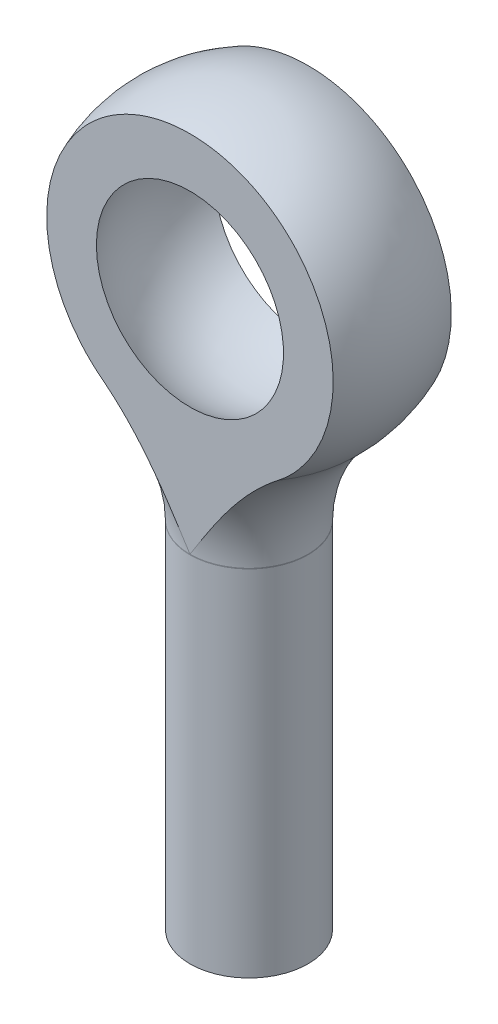
ISO-10303-21;
HEADER;
FILE_DESCRIPTION(('STEP AP214'),'2;1');
FILE_NAME('part.step','',(''),(''),'','','');
FILE_SCHEMA(('AUTOMOTIVE_DESIGN { 1 0 10303 214 1 1 1 1 }'));
ENDSEC;
DATA;
#1=APPLICATION_CONTEXT('core data for automotive mechanical design processes');
#2=APPLICATION_PROTOCOL_DEFINITION('international standard','automotive_design',2000,#1);
#3=PRODUCT_CONTEXT('',#1,'mechanical');
#4=PRODUCT('Part','Part','',(#3));
#5=PRODUCT_RELATED_PRODUCT_CATEGORY('part','',(#4));
#6=PRODUCT_DEFINITION_FORMATION('','',#4);
#7=PRODUCT_DEFINITION_CONTEXT('part definition',#1,'design');
#8=PRODUCT_DEFINITION('design','',#6,#7);
#9=PRODUCT_DEFINITION_SHAPE('','',#8);
#10=(LENGTH_UNIT() NAMED_UNIT(*) SI_UNIT(.MILLI.,.METRE.));
#11=(NAMED_UNIT(*) PLANE_ANGLE_UNIT() SI_UNIT($,.RADIAN.));
#12=(NAMED_UNIT(*) SI_UNIT($,.STERADIAN.) SOLID_ANGLE_UNIT());
#13=UNCERTAINTY_MEASURE_WITH_UNIT(LENGTH_MEASURE(1.E-05),#10,'distance_accuracy_value','');
#14=(GEOMETRIC_REPRESENTATION_CONTEXT(3) GLOBAL_UNCERTAINTY_ASSIGNED_CONTEXT((#13)) GLOBAL_UNIT_ASSIGNED_CONTEXT((#10,
#11,#12)) REPRESENTATION_CONTEXT('',''));
#15=CARTESIAN_POINT('',(0.,0.,0.));
#16=DIRECTION('',(0.,0.,1.));
#17=DIRECTION('',(1.,0.,0.));
#18=AXIS2_PLACEMENT_3D('',#15,#16,#17);
#19=CARTESIAN_POINT('',(0.,500000.,0.));
#20=DIRECTION('',(0.,-1.,0.));
#21=DIRECTION('',(0.,0.,-1.));
#22=AXIS2_PLACEMENT_3D('',#19,#20,#21);
#23=CYLINDRICAL_SURFACE('',#22,6.35);
#24=CARTESIAN_POINT('',(0.,-61.9252,0.));
#25=DIRECTION('',(0.,1.,0.));
#26=DIRECTION('',(0.,0.,1.));
#27=AXIS2_PLACEMENT_3D('',#24,#25,#26);
#28=CIRCLE('',#27,6.35);
#29=CARTESIAN_POINT('',(0.,-61.9252,6.35));
#30=VERTEX_POINT('',#29);
#31=EDGE_CURVE('E207',#30,#30,#28,.T.);
#32=ORIENTED_EDGE('',*,*,#31,.T.);
#33=EDGE_LOOP('',(#32));
#34=FACE_BOUND('',#33,.T.);
#35=CARTESIAN_POINT('',(0.,-23.8251999999761,0.));
#36=DIRECTION('',(0.,1.,0.));
#37=DIRECTION('',(0.,0.,1.));
#38=AXIS2_PLACEMENT_3D('',#35,#36,#37);
#39=CIRCLE('',#38,6.35);
#40=CARTESIAN_POINT('',(0.,-23.8251999999761,6.35));
#41=VERTEX_POINT('',#40);
#42=EDGE_CURVE('E11',#41,#41,#39,.T.);
#43=ORIENTED_EDGE('',*,*,#42,.F.);
#44=EDGE_LOOP('',(#43));
#45=FACE_BOUND('',#44,.T.);
#46=ADVANCED_FACE('F33',(#34,#45),#23,.T.);
#47=CARTESIAN_POINT('',(0.,-23.764085796849,0.));
#48=DIRECTION('',(0.,1.,0.));
#49=DIRECTION('',(0.,0.,1.));
#50=AXIS2_PLACEMENT_3D('',#47,#48,#49);
#51=TOROIDAL_SURFACE('',#50,22.225,15.875);
#52=CARTESIAN_POINT('',(0.,-23.7640857968699,0.));
#53=DIRECTION('',(0.,1.,0.));
#54=DIRECTION('',(0.,0.,1.));
#55=AXIS2_PLACEMENT_3D('',#52,#53,#54);
#56=CIRCLE('',#55,6.35);
#57=CARTESIAN_POINT('',(0.,-23.7640857968699,6.35));
#58=VERTEX_POINT('',#57);
#59=CARTESIAN_POINT('',(0.,-23.7640857968699,-6.35));
#60=VERTEX_POINT('',#59);
#61=EDGE_CURVE('E57',#58,#60,#56,.F.);
#62=ORIENTED_EDGE('',*,*,#61,.F.);
#63=CARTESIAN_POINT('',(0.,-23.764085796849,6.35));
#64=CARTESIAN_POINT('',(-0.00448984716126769,-23.7569867241387,6.35));
#65=CARTESIAN_POINT('',(-0.00897969462927698,-23.7498876519898,6.35));
#66=CARTESIAN_POINT('',(-0.583050319482661,-22.842204567849,6.35));
#67=CARTESIAN_POINT('',(-1.15275727114214,-21.9417066279042,6.35));
#68=CARTESIAN_POINT('',(-2.32335162742201,-20.160177709213,6.35));
#69=CARTESIAN_POINT('',(-2.92424781876735,-19.2791523170995,6.35));
#70=CARTESIAN_POINT('',(-3.86795157505741,-17.9901471026716,6.35));
#71=CARTESIAN_POINT('',(-4.18913741672609,-17.5664271345477,6.35));
#72=CARTESIAN_POINT('',(-4.84845598241763,-16.7324294342148,6.35));
#73=CARTESIAN_POINT('',(-5.18658595834078,-16.3221495399508,6.35));
#74=CARTESIAN_POINT('',(-5.88177845584032,-15.5184579602398,6.35));
#75=CARTESIAN_POINT('',(-6.23882540206243,-15.1250328656359,6.35));
#76=CARTESIAN_POINT('',(-6.97363010371919,-14.3581134853306,6.35));
#77=CARTESIAN_POINT('',(-7.35138337572862,-13.98461491934,6.35));
#78=CARTESIAN_POINT('',(-8.16180930720019,-13.230048098124,6.35));
#79=CARTESIAN_POINT('',(-8.59641862075767,-12.8510482302285,6.35));
#80=CARTESIAN_POINT('',(-9.4916436740845,-12.1249915308166,6.35));
#81=CARTESIAN_POINT('',(-9.95225948168154,-11.7779347826175,6.35));
#82=CARTESIAN_POINT('',(-10.8993622631317,-11.1199434841251,6.35));
#83=CARTESIAN_POINT('',(-11.3858737819888,-10.8090441271136,6.35));
#84=CARTESIAN_POINT('',(-12.3828049973355,-10.2281483905436,6.35));
#85=CARTESIAN_POINT('',(-12.893224404853,-9.9581515167679,6.35));
#86=CARTESIAN_POINT('',(-13.9397980953899,-9.46116102092254,6.35));
#87=CARTESIAN_POINT('',(-14.4761289787481,-9.23453789324361,6.35));
#88=CARTESIAN_POINT('',(-15.5672362557874,-8.83091626349336,6.35));
#89=CARTESIAN_POINT('',(-16.1220132687936,-8.65391942950051,6.35));
#90=CARTESIAN_POINT('',(-17.2451790893523,-8.35308665898777,6.35));
#91=CARTESIAN_POINT('',(-17.8135518452561,-8.22919101180703,6.35));
#92=CARTESIAN_POINT('',(-18.9596366725442,-8.03703020888307,6.35));
#93=CARTESIAN_POINT('',(-19.5373477965836,-7.96875944586452,6.35));
#94=CARTESIAN_POINT('',(-20.6392597037418,-7.89379535041776,6.35));
#95=CARTESIAN_POINT('',(-21.1630945300894,-7.88167392137649,6.35));
#96=CARTESIAN_POINT('',(-22.2096193822471,-7.90521199826917,6.35));
#97=CARTESIAN_POINT('',(-22.7323095864623,-7.94086343474808,6.35));
#98=CARTESIAN_POINT('',(-23.7748382287456,-8.06073443349305,6.35));
#99=CARTESIAN_POINT('',(-24.294649486187,-8.14519507601028,6.35));
#100=CARTESIAN_POINT('',(-25.0666389602046,-8.30835636806882,6.35));
#101=CARTESIAN_POINT('',(-25.322781678413,-8.36885332253963,6.35));
#102=CARTESIAN_POINT('',(-25.8319149361716,-8.50194972045422,6.35));
#103=CARTESIAN_POINT('',(-26.0849053338249,-8.57454970659687,6.35));
#104=CARTESIAN_POINT('',(-26.336056281303,-8.65316887921814,6.35));
#105=B_SPLINE_CURVE_WITH_KNOTS('',3,(#63,#64,#65,#66,#67,#68,#69,#70,#71,#72,#73,#74,#75,#76,
#77,#78,#79,#80,#81,#82,#83,#84,#85,#86,#87,#88,#89,#90,#91,#92,#93,#94,#95,#96,#97,#98,#99,
#100,#101,#102,#103,#104),.UNSPECIFIED.,.F.,.F.,(4,2,2,2,2,2,2,2,2,2,2,2,2,2,2,2,2,2,2,2,4),(0.,
0.0251992063367074,3.2219577543257,6.41962184317637,8.01434035113322,9.60880105008244,
11.2019687507058,12.7947928438808,14.5233847271884,16.2519811190548,17.9822461783528,
19.7124903295038,21.4569120178464,23.2013923340514,24.9439058559148,26.6862437016848,
28.2560519342562,29.8255950393301,31.4029575667671,32.1922698221303,32.9816174797104),.UNSPECIFIED.);
#106=CARTESIAN_POINT('',(-9.44532893185531,-12.1695864814322,6.35));
#107=VERTEX_POINT('',#106);
#108=EDGE_CURVE('E50',#58,#107,#105,.T.);
#109=ORIENTED_EDGE('',*,*,#108,.T.);
#110=CARTESIAN_POINT('',(0.,-12.1695864814465,0.));
#111=DIRECTION('',(0.,1.,0.));
#112=DIRECTION('',(0.,0.,1.));
#113=AXIS2_PLACEMENT_3D('',#110,#111,#112);
#114=CIRCLE('',#113,11.3814207650273);
#115=CARTESIAN_POINT('',(-9.44532893185531,-12.1695864814322,-6.35));
#116=VERTEX_POINT('',#115);
#117=EDGE_CURVE('E43',#116,#107,#114,.T.);
#118=ORIENTED_EDGE('',*,*,#117,.F.);
#119=CARTESIAN_POINT('',(0.,-23.764085796849,-6.35));
#120=CARTESIAN_POINT('',(-0.00448984716126769,-23.7569867241387,-6.35));
#121=CARTESIAN_POINT('',(-0.00897969462927698,-23.7498876519898,-6.35));
#122=CARTESIAN_POINT('',(-0.583050319482661,-22.842204567849,-6.35));
#123=CARTESIAN_POINT('',(-1.15275727114214,-21.9417066279042,-6.35));
#124=CARTESIAN_POINT('',(-2.32335162742201,-20.160177709213,-6.35));
#125=CARTESIAN_POINT('',(-2.92424781876735,-19.2791523170995,-6.35));
#126=CARTESIAN_POINT('',(-3.86795157505741,-17.9901471026716,-6.35));
#127=CARTESIAN_POINT('',(-4.18913741672609,-17.5664271345477,-6.35));
#128=CARTESIAN_POINT('',(-4.84845598241763,-16.7324294342148,-6.35));
#129=CARTESIAN_POINT('',(-5.18658595834078,-16.3221495399508,-6.35));
#130=CARTESIAN_POINT('',(-5.88177845584032,-15.5184579602398,-6.35));
#131=CARTESIAN_POINT('',(-6.23882540206243,-15.1250328656359,-6.35));
#132=CARTESIAN_POINT('',(-6.97363010371919,-14.3581134853306,-6.35));
#133=CARTESIAN_POINT('',(-7.35138337572862,-13.98461491934,-6.35));
#134=CARTESIAN_POINT('',(-8.16180930720019,-13.230048098124,-6.35));
#135=CARTESIAN_POINT('',(-8.59641862075767,-12.8510482302285,-6.35));
#136=CARTESIAN_POINT('',(-9.4916436740845,-12.1249915308166,-6.35));
#137=CARTESIAN_POINT('',(-9.95225948168154,-11.7779347826175,-6.35));
#138=CARTESIAN_POINT('',(-10.8993622631317,-11.1199434841251,-6.35));
#139=CARTESIAN_POINT('',(-11.3858737819888,-10.8090441271136,-6.35));
#140=CARTESIAN_POINT('',(-12.3828049973355,-10.2281483905436,-6.35));
#141=CARTESIAN_POINT('',(-12.893224404853,-9.9581515167679,-6.35));
#142=CARTESIAN_POINT('',(-13.9397980953899,-9.46116102092254,-6.35));
#143=CARTESIAN_POINT('',(-14.4761289787481,-9.23453789324361,-6.35));
#144=CARTESIAN_POINT('',(-15.5672362557874,-8.83091626349336,-6.35));
#145=CARTESIAN_POINT('',(-16.1220132687936,-8.65391942950051,-6.35));
#146=CARTESIAN_POINT('',(-17.2451790893523,-8.35308665898777,-6.35));
#147=CARTESIAN_POINT('',(-17.8135518452561,-8.22919101180703,-6.35));
#148=CARTESIAN_POINT('',(-18.9596366725442,-8.03703020888307,-6.35));
#149=CARTESIAN_POINT('',(-19.5373477965836,-7.96875944586452,-6.35));
#150=CARTESIAN_POINT('',(-20.6392597037418,-7.89379535041776,-6.35));
#151=CARTESIAN_POINT('',(-21.1630945300894,-7.88167392137649,-6.35));
#152=CARTESIAN_POINT('',(-22.2096193822471,-7.90521199826917,-6.35));
#153=CARTESIAN_POINT('',(-22.7323095864623,-7.94086343474808,-6.35));
#154=CARTESIAN_POINT('',(-23.7748382287456,-8.06073443349305,-6.35));
#155=CARTESIAN_POINT('',(-24.294649486187,-8.14519507601028,-6.35));
#156=CARTESIAN_POINT('',(-25.0666389602046,-8.30835636806882,-6.35));
#157=CARTESIAN_POINT('',(-25.322781678413,-8.36885332253963,-6.35));
#158=CARTESIAN_POINT('',(-25.8319149361716,-8.50194972045422,-6.35));
#159=CARTESIAN_POINT('',(-26.0849053338249,-8.57454970659687,-6.35));
#160=CARTESIAN_POINT('',(-26.336056281303,-8.65316887921814,-6.35));
#161=B_SPLINE_CURVE_WITH_KNOTS('',3,(#119,#120,#121,#122,#123,#124,#125,#126,#127,#128,#129,
#130,#131,#132,#133,#134,#135,#136,#137,#138,#139,#140,#141,#142,#143,#144,#145,#146,#147,#148,
#149,#150,#151,#152,#153,#154,#155,#156,#157,#158,#159,#160),.UNSPECIFIED.,.F.,.F.,(4,2,2,2,2,2,
2,2,2,2,2,2,2,2,2,2,2,2,2,2,4),(0.,0.0251992063367074,3.2219577543257,6.41962184317637,
8.01434035113322,9.60880105008244,11.2019687507058,12.7947928438808,14.5233847271884,
16.2519811190548,17.9822461783528,19.7124903295038,21.4569120178464,23.2013923340514,
24.9439058559148,26.6862437016848,28.2560519342562,29.8255950393301,31.4029575667671,
32.1922698221303,32.9816174797104),.UNSPECIFIED.);
#162=EDGE_CURVE('E94',#116,#60,#161,.F.);
#163=ORIENTED_EDGE('',*,*,#162,.T.);
#164=EDGE_LOOP('',(#62,#109,#118,#163));
#165=FACE_BOUND('',#164,.T.);
#166=ADVANCED_FACE('F110',(#165),#51,.F.);
#167=CARTESIAN_POINT('',(0.,0.,0.));
#168=DIRECTION('',(0.,-1.,0.));
#169=DIRECTION('',(1.,0.,0.));
#170=AXIS2_PLACEMENT_3D('',#167,#168,#169);
#171=SPHERICAL_SURFACE('',#170,16.6624);
#172=ORIENTED_EDGE('',*,*,#117,.T.);
#173=CARTESIAN_POINT('',(0.,0.,6.35));
#174=DIRECTION('',(0.,0.,-1.));
#175=DIRECTION('',(-1.,0.,0.));
#176=AXIS2_PLACEMENT_3D('',#173,#174,#175);
#177=CIRCLE('',#176,15.4049691255776);
#178=CARTESIAN_POINT('',(9.44532893185531,-12.1695864814322,6.35));
#179=VERTEX_POINT('',#178);
#180=EDGE_CURVE('E71',#107,#179,#177,.T.);
#181=ORIENTED_EDGE('',*,*,#180,.T.);
#182=CARTESIAN_POINT('',(9.44532893185531,-12.1695864814322,-6.35));
#183=VERTEX_POINT('',#182);
#184=EDGE_CURVE('E81',#179,#183,#114,.T.);
#185=ORIENTED_EDGE('',*,*,#184,.T.);
#186=CARTESIAN_POINT('',(0.,0.,-6.35));
#187=DIRECTION('',(0.,0.,1.));
#188=DIRECTION('',(1.,0.,0.));
#189=AXIS2_PLACEMENT_3D('',#186,#187,#188);
#190=CIRCLE('',#189,15.4049691255776);
#191=EDGE_CURVE('E206',#183,#116,#190,.T.);
#192=ORIENTED_EDGE('',*,*,#191,.T.);
#193=EDGE_LOOP('',(#172,#181,#185,#192));
#194=FACE_BOUND('',#193,.T.);
#195=ADVANCED_FACE('F79',(#194),#171,.T.);
#196=CARTESIAN_POINT('',(0.,-61.9252,0.));
#197=DIRECTION('',(0.,1.,0.));
#198=DIRECTION('',(0.,0.,1.));
#199=AXIS2_PLACEMENT_3D('',#196,#197,#198);
#200=PLANE('',#199);
#201=ORIENTED_EDGE('',*,*,#31,.F.);
#202=EDGE_LOOP('',(#201));
#203=FACE_BOUND('',#202,.T.);
#204=ADVANCED_FACE('F123',(#203),#200,.F.);
#205=ORIENTED_EDGE('',*,*,#42,.T.);
#206=EDGE_LOOP('',(#205));
#207=FACE_BOUND('',#206,.T.);
#208=EDGE_CURVE('E88',#60,#58,#56,.F.);
#209=ORIENTED_EDGE('',*,*,#208,.T.);
#210=ORIENTED_EDGE('',*,*,#61,.T.);
#211=EDGE_LOOP('',(#209,#210));
#212=FACE_BOUND('',#211,.T.);
#213=ADVANCED_FACE('F113',(#207,#212),#23,.T.);
#214=ORIENTED_EDGE('',*,*,#184,.F.);
#215=CARTESIAN_POINT('',(0.,-23.764085796849,6.35));
#216=CARTESIAN_POINT('',(0.00448984716126769,-23.7569867241387,6.35));
#217=CARTESIAN_POINT('',(0.00897969462927698,-23.7498876519898,6.35));
#218=CARTESIAN_POINT('',(0.583050319482661,-22.842204567849,6.35));
#219=CARTESIAN_POINT('',(1.15275727114214,-21.9417066279042,6.35));
#220=CARTESIAN_POINT('',(2.32335162742201,-20.160177709213,6.35));
#221=CARTESIAN_POINT('',(2.92424781876735,-19.2791523170995,6.35));
#222=CARTESIAN_POINT('',(3.86795157505741,-17.9901471026716,6.35));
#223=CARTESIAN_POINT('',(4.18913741672609,-17.5664271345477,6.35));
#224=CARTESIAN_POINT('',(4.84845598241763,-16.7324294342148,6.35));
#225=CARTESIAN_POINT('',(5.18658595834078,-16.3221495399508,6.35));
#226=CARTESIAN_POINT('',(5.88177845584032,-15.5184579602398,6.35));
#227=CARTESIAN_POINT('',(6.23882540206243,-15.1250328656359,6.35));
#228=CARTESIAN_POINT('',(6.97363010371919,-14.3581134853306,6.35));
#229=CARTESIAN_POINT('',(7.35138337572862,-13.98461491934,6.35));
#230=CARTESIAN_POINT('',(8.16180930720019,-13.230048098124,6.35));
#231=CARTESIAN_POINT('',(8.59641862075767,-12.8510482302285,6.35));
#232=CARTESIAN_POINT('',(9.4916436740845,-12.1249915308166,6.35));
#233=CARTESIAN_POINT('',(9.95225948168154,-11.7779347826175,6.35));
#234=CARTESIAN_POINT('',(10.8993622631317,-11.1199434841251,6.35));
#235=CARTESIAN_POINT('',(11.3858737819888,-10.8090441271136,6.35));
#236=CARTESIAN_POINT('',(12.3828049973355,-10.2281483905436,6.35));
#237=CARTESIAN_POINT('',(12.893224404853,-9.9581515167679,6.35));
#238=CARTESIAN_POINT('',(13.9397980953899,-9.46116102092254,6.35));
#239=CARTESIAN_POINT('',(14.4761289787481,-9.23453789324361,6.35));
#240=CARTESIAN_POINT('',(15.5672362557874,-8.83091626349336,6.35));
#241=CARTESIAN_POINT('',(16.1220132687936,-8.65391942950051,6.35));
#242=CARTESIAN_POINT('',(17.2451790893523,-8.35308665898777,6.35));
#243=CARTESIAN_POINT('',(17.8135518452561,-8.22919101180703,6.35));
#244=CARTESIAN_POINT('',(18.9596366725442,-8.03703020888307,6.35));
#245=CARTESIAN_POINT('',(19.5373477965836,-7.96875944586452,6.35));
#246=CARTESIAN_POINT('',(20.6392597037418,-7.89379535041776,6.35));
#247=CARTESIAN_POINT('',(21.1630945300894,-7.88167392137649,6.35));
#248=CARTESIAN_POINT('',(22.2096193822471,-7.90521199826917,6.35));
#249=CARTESIAN_POINT('',(22.7323095864623,-7.94086343474808,6.35));
#250=CARTESIAN_POINT('',(23.7748382287456,-8.06073443349305,6.35));
#251=CARTESIAN_POINT('',(24.294649486187,-8.14519507601028,6.35));
#252=CARTESIAN_POINT('',(25.0666389602046,-8.30835636806882,6.35));
#253=CARTESIAN_POINT('',(25.322781678413,-8.36885332253963,6.35));
#254=CARTESIAN_POINT('',(25.8319149361716,-8.50194972045422,6.35));
#255=CARTESIAN_POINT('',(26.0849053338249,-8.57454970659687,6.35));
#256=CARTESIAN_POINT('',(26.336056281303,-8.65316887921814,6.35));
#257=B_SPLINE_CURVE_WITH_KNOTS('',3,(#215,#216,#217,#218,#219,#220,#221,#222,#223,#224,#225,
#226,#227,#228,#229,#230,#231,#232,#233,#234,#235,#236,#237,#238,#239,#240,#241,#242,#243,#244,
#245,#246,#247,#248,#249,#250,#251,#252,#253,#254,#255,#256),.UNSPECIFIED.,.F.,.F.,(4,2,2,2,2,2,
2,2,2,2,2,2,2,2,2,2,2,2,2,2,4),(0.,0.0251992063367074,3.2219577543257,6.41962184317637,
8.01434035113322,9.60880105008244,11.2019687507058,12.7947928438808,14.5233847271884,
16.2519811190548,17.9822461783528,19.7124903295038,21.4569120178464,23.2013923340514,
24.9439058559148,26.6862437016848,28.2560519342562,29.8255950393301,31.4029575667671,
32.1922698221303,32.9816174797104),.UNSPECIFIED.);
#258=EDGE_CURVE('E68',#179,#58,#257,.F.);
#259=ORIENTED_EDGE('',*,*,#258,.T.);
#260=ORIENTED_EDGE('',*,*,#208,.F.);
#261=CARTESIAN_POINT('',(0.,-23.764085796849,-6.35));
#262=CARTESIAN_POINT('',(0.00448984716126769,-23.7569867241387,-6.35));
#263=CARTESIAN_POINT('',(0.00897969462927698,-23.7498876519898,-6.35));
#264=CARTESIAN_POINT('',(0.583050319482661,-22.842204567849,-6.35));
#265=CARTESIAN_POINT('',(1.15275727114214,-21.9417066279042,-6.35));
#266=CARTESIAN_POINT('',(2.32335162742201,-20.160177709213,-6.35));
#267=CARTESIAN_POINT('',(2.92424781876735,-19.2791523170995,-6.35));
#268=CARTESIAN_POINT('',(3.86795157505741,-17.9901471026716,-6.35));
#269=CARTESIAN_POINT('',(4.18913741672609,-17.5664271345477,-6.35));
#270=CARTESIAN_POINT('',(4.84845598241763,-16.7324294342148,-6.35));
#271=CARTESIAN_POINT('',(5.18658595834078,-16.3221495399508,-6.35));
#272=CARTESIAN_POINT('',(5.88177845584032,-15.5184579602398,-6.35));
#273=CARTESIAN_POINT('',(6.23882540206243,-15.1250328656359,-6.35));
#274=CARTESIAN_POINT('',(6.97363010371919,-14.3581134853306,-6.35));
#275=CARTESIAN_POINT('',(7.35138337572862,-13.98461491934,-6.35));
#276=CARTESIAN_POINT('',(8.16180930720019,-13.230048098124,-6.35));
#277=CARTESIAN_POINT('',(8.59641862075767,-12.8510482302285,-6.35));
#278=CARTESIAN_POINT('',(9.4916436740845,-12.1249915308166,-6.35));
#279=CARTESIAN_POINT('',(9.95225948168154,-11.7779347826175,-6.35));
#280=CARTESIAN_POINT('',(10.8993622631317,-11.1199434841251,-6.35));
#281=CARTESIAN_POINT('',(11.3858737819888,-10.8090441271136,-6.35));
#282=CARTESIAN_POINT('',(12.3828049973355,-10.2281483905436,-6.35));
#283=CARTESIAN_POINT('',(12.893224404853,-9.9581515167679,-6.35));
#284=CARTESIAN_POINT('',(13.9397980953899,-9.46116102092254,-6.35));
#285=CARTESIAN_POINT('',(14.4761289787481,-9.23453789324361,-6.35));
#286=CARTESIAN_POINT('',(15.5672362557874,-8.83091626349336,-6.35));
#287=CARTESIAN_POINT('',(16.1220132687936,-8.65391942950051,-6.35));
#288=CARTESIAN_POINT('',(17.2451790893523,-8.35308665898777,-6.35));
#289=CARTESIAN_POINT('',(17.8135518452561,-8.22919101180703,-6.35));
#290=CARTESIAN_POINT('',(18.9596366725442,-8.03703020888307,-6.35));
#291=CARTESIAN_POINT('',(19.5373477965836,-7.96875944586452,-6.35));
#292=CARTESIAN_POINT('',(20.6392597037418,-7.89379535041776,-6.35));
#293=CARTESIAN_POINT('',(21.1630945300894,-7.88167392137649,-6.35));
#294=CARTESIAN_POINT('',(22.2096193822471,-7.90521199826917,-6.35));
#295=CARTESIAN_POINT('',(22.7323095864623,-7.94086343474808,-6.35));
#296=CARTESIAN_POINT('',(23.7748382287456,-8.06073443349305,-6.35));
#297=CARTESIAN_POINT('',(24.294649486187,-8.14519507601028,-6.35));
#298=CARTESIAN_POINT('',(25.0666389602046,-8.30835636806882,-6.35));
#299=CARTESIAN_POINT('',(25.322781678413,-8.36885332253963,-6.35));
#300=CARTESIAN_POINT('',(25.8319149361716,-8.50194972045422,-6.35));
#301=CARTESIAN_POINT('',(26.0849053338249,-8.57454970659687,-6.35));
#302=CARTESIAN_POINT('',(26.336056281303,-8.65316887921814,-6.35));
#303=B_SPLINE_CURVE_WITH_KNOTS('',3,(#261,#262,#263,#264,#265,#266,#267,#268,#269,#270,#271,
#272,#273,#274,#275,#276,#277,#278,#279,#280,#281,#282,#283,#284,#285,#286,#287,#288,#289,#290,
#291,#292,#293,#294,#295,#296,#297,#298,#299,#300,#301,#302),.UNSPECIFIED.,.F.,.F.,(4,2,2,2,2,2,
2,2,2,2,2,2,2,2,2,2,2,2,2,2,4),(0.,0.0251992063367074,3.2219577543257,6.41962184317637,
8.01434035113322,9.60880105008244,11.2019687507058,12.7947928438808,14.5233847271884,
16.2519811190548,17.9822461783528,19.7124903295038,21.4569120178464,23.2013923340514,
24.9439058559148,26.6862437016848,28.2560519342562,29.8255950393301,31.4029575667671,
32.1922698221303,32.9816174797104),.UNSPECIFIED.);
#304=EDGE_CURVE('E87',#60,#183,#303,.T.);
#305=ORIENTED_EDGE('',*,*,#304,.T.);
#306=EDGE_LOOP('',(#214,#259,#260,#305));
#307=FACE_BOUND('',#306,.T.);
#308=ADVANCED_FACE('F35',(#307),#51,.F.);
#309=CARTESIAN_POINT('',(-27.94,-25.4,-6.35));
#310=DIRECTION('',(0.,0.,1.));
#311=DIRECTION('',(1.,0.,0.));
#312=AXIS2_PLACEMENT_3D('',#309,#310,#311);
#313=PLANE('',#312);
#314=CARTESIAN_POINT('',(0.,0.,-6.35));
#315=DIRECTION('',(0.,0.,1.));
#316=DIRECTION('',(1.,0.,0.));
#317=AXIS2_PLACEMENT_3D('',#314,#315,#316);
#318=CIRCLE('',#317,10.064050874772);
#319=CARTESIAN_POINT('',(10.064050874772,0.,-6.35));
#320=VERTEX_POINT('',#319);
#321=EDGE_CURVE('E84',#320,#320,#318,.F.);
#322=ORIENTED_EDGE('',*,*,#321,.F.);
#323=EDGE_LOOP('',(#322));
#324=FACE_BOUND('',#323,.T.);
#325=ORIENTED_EDGE('',*,*,#304,.F.);
#326=ORIENTED_EDGE('',*,*,#162,.F.);
#327=ORIENTED_EDGE('',*,*,#191,.F.);
#328=EDGE_LOOP('',(#325,#326,#327));
#329=FACE_BOUND('',#328,.T.);
#330=ADVANCED_FACE('F106',(#324,#329),#313,.F.);
#331=CARTESIAN_POINT('',(0.,0.,0.));
#332=DIRECTION('',(0.,-1.,0.));
#333=DIRECTION('',(1.,0.,0.));
#334=AXIS2_PLACEMENT_3D('',#331,#332,#333);
#335=SPHERICAL_SURFACE('',#334,11.8999);
#336=CARTESIAN_POINT('',(0.,0.,0.));
#337=DIRECTION('',(0.,0.,-1.));
#338=DIRECTION('',(-1.,0.,0.));
#339=AXIS2_PLACEMENT_3D('',#336,#337,#338);
#340=SPHERICAL_SURFACE('',#339,11.8999);
#341=CARTESIAN_POINT('',(0.,0.,6.35));
#342=DIRECTION('',(0.,0.,-1.));
#343=DIRECTION('',(-1.,0.,0.));
#344=AXIS2_PLACEMENT_3D('',#341,#342,#343);
#345=CIRCLE('',#344,10.064050874772);
#346=CARTESIAN_POINT('',(-10.064050874772,0.,6.35));
#347=VERTEX_POINT('',#346);
#348=EDGE_CURVE('E75',#347,#347,#345,.F.);
#349=ORIENTED_EDGE('',*,*,#348,.T.);
#350=EDGE_LOOP('',(#349));
#351=FACE_BOUND('',#350,.T.);
#352=ORIENTED_EDGE('',*,*,#321,.T.);
#353=EDGE_LOOP('',(#352));
#354=FACE_BOUND('',#353,.T.);
#355=ADVANCED_FACE('F98',(#351,#354),#340,.F.);
#356=CARTESIAN_POINT('',(-27.94,-25.4,6.35));
#357=DIRECTION('',(0.,0.,-1.));
#358=DIRECTION('',(1.,0.,0.));
#359=AXIS2_PLACEMENT_3D('',#356,#357,#358);
#360=PLANE('',#359);
#361=ORIENTED_EDGE('',*,*,#348,.F.);
#362=EDGE_LOOP('',(#361));
#363=FACE_BOUND('',#362,.T.);
#364=ORIENTED_EDGE('',*,*,#108,.F.);
#365=ORIENTED_EDGE('',*,*,#258,.F.);
#366=ORIENTED_EDGE('',*,*,#180,.F.);
#367=EDGE_LOOP('',(#364,#365,#366));
#368=FACE_BOUND('',#367,.T.);
#369=ADVANCED_FACE('F70',(#363,#368),#360,.F.);
#370=CLOSED_SHELL('',(#46,#166,#195,#204,#213,#308,#330,#355,#369));
#371=MANIFOLD_SOLID_BREP('B2',#370);
#372=ADVANCED_BREP_SHAPE_REPRESENTATION('',(#18,#371),#14);
#373=SHAPE_DEFINITION_REPRESENTATION(#9,#372);
ENDSEC;
END-ISO-10303-21;
